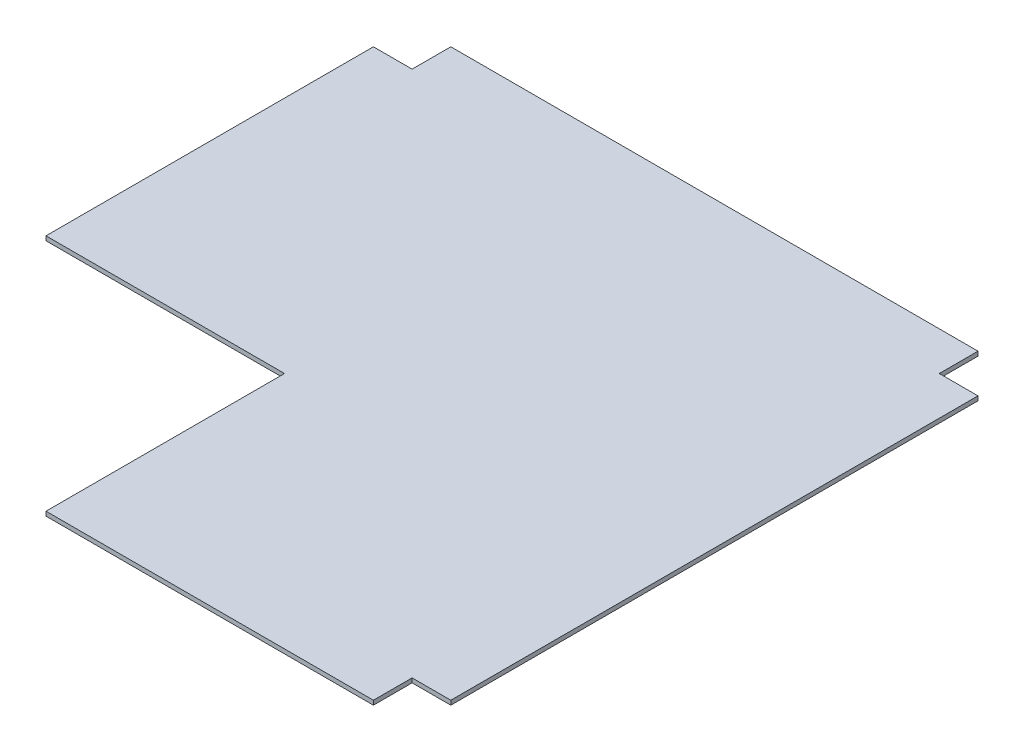
ISO-10303-21;
HEADER;
FILE_DESCRIPTION(('STEP AP214'),'2;1');
FILE_NAME('part.step','',(''),(''),'','','');
FILE_SCHEMA(('AUTOMOTIVE_DESIGN { 1 0 10303 214 1 1 1 1 }'));
ENDSEC;
DATA;
#1=APPLICATION_CONTEXT('core data for automotive mechanical design processes');
#2=APPLICATION_PROTOCOL_DEFINITION('international standard','automotive_design',2000,#1);
#3=PRODUCT_CONTEXT('',#1,'mechanical');
#4=PRODUCT('Part','Part','',(#3));
#5=PRODUCT_RELATED_PRODUCT_CATEGORY('part','',(#4));
#6=PRODUCT_DEFINITION_FORMATION('','',#4);
#7=PRODUCT_DEFINITION_CONTEXT('part definition',#1,'design');
#8=PRODUCT_DEFINITION('design','',#6,#7);
#9=PRODUCT_DEFINITION_SHAPE('','',#8);
#10=(LENGTH_UNIT() NAMED_UNIT(*) SI_UNIT(.MILLI.,.METRE.));
#11=(NAMED_UNIT(*) PLANE_ANGLE_UNIT() SI_UNIT($,.RADIAN.));
#12=(NAMED_UNIT(*) SI_UNIT($,.STERADIAN.) SOLID_ANGLE_UNIT());
#13=UNCERTAINTY_MEASURE_WITH_UNIT(LENGTH_MEASURE(1.E-05),#10,'distance_accuracy_value','');
#14=(GEOMETRIC_REPRESENTATION_CONTEXT(3) GLOBAL_UNCERTAINTY_ASSIGNED_CONTEXT((#13)) GLOBAL_UNIT_ASSIGNED_CONTEXT((#10,
#11,#12)) REPRESENTATION_CONTEXT('',''));
#15=CARTESIAN_POINT('',(0.,0.,0.));
#16=DIRECTION('',(0.,0.,1.));
#17=DIRECTION('',(1.,0.,0.));
#18=AXIS2_PLACEMENT_3D('',#15,#16,#17);
#19=CARTESIAN_POINT('',(175.,3.175,0.));
#20=DIRECTION('',(-1.,0.,0.));
#21=DIRECTION('',(0.,0.,1.));
#22=AXIS2_PLACEMENT_3D('',#19,#20,#21);
#23=PLANE('',#22);
#24=DIRECTION('',(0.,0.,-1.));
#25=VECTOR('',#24,1.);
#26=CARTESIAN_POINT('',(175.,0.,0.));
#27=LINE('',#26,#25);
#28=CARTESIAN_POINT('',(175.,0.,0.));
#29=VERTEX_POINT('',#28);
#30=CARTESIAN_POINT('',(175.,0.,-175.));
#31=VERTEX_POINT('',#30);
#32=EDGE_CURVE('E168',#29,#31,#27,.T.);
#33=ORIENTED_EDGE('',*,*,#32,.F.);
#34=DIRECTION('',(0.,-1.,0.));
#35=VECTOR('',#34,1.);
#36=CARTESIAN_POINT('',(175.,3.175,0.));
#37=LINE('',#36,#35);
#38=CARTESIAN_POINT('',(175.,3.175,0.));
#39=VERTEX_POINT('',#38);
#40=EDGE_CURVE('E11',#39,#29,#37,.T.);
#41=ORIENTED_EDGE('',*,*,#40,.F.);
#42=DIRECTION('',(0.,0.,-1.));
#43=VECTOR('',#42,1.);
#44=CARTESIAN_POINT('',(175.,3.175,0.));
#45=LINE('',#44,#43);
#46=CARTESIAN_POINT('',(175.,3.175,-175.));
#47=VERTEX_POINT('',#46);
#48=EDGE_CURVE('E210',#39,#47,#45,.T.);
#49=ORIENTED_EDGE('',*,*,#48,.T.);
#50=DIRECTION('',(0.,-1.,0.));
#51=VECTOR('',#50,1.);
#52=CARTESIAN_POINT('',(175.,3.175,-175.));
#53=LINE('',#52,#51);
#54=EDGE_CURVE('E108',#47,#31,#53,.T.);
#55=ORIENTED_EDGE('',*,*,#54,.T.);
#56=EDGE_LOOP('',(#33,#41,#49,#55));
#57=FACE_BOUND('',#56,.T.);
#58=ADVANCED_FACE('F45',(#57),#23,.T.);
#59=CARTESIAN_POINT('',(0.,3.175,0.));
#60=DIRECTION('',(0.,0.,-1.));
#61=DIRECTION('',(-1.,0.,0.));
#62=AXIS2_PLACEMENT_3D('',#59,#60,#61);
#63=PLANE('',#62);
#64=DIRECTION('',(1.,0.,0.));
#65=VECTOR('',#64,1.);
#66=CARTESIAN_POINT('',(0.,0.,0.));
#67=LINE('',#66,#65);
#68=CARTESIAN_POINT('',(415.25,0.,0.));
#69=VERTEX_POINT('',#68);
#70=EDGE_CURVE('E172',#29,#69,#67,.T.);
#71=ORIENTED_EDGE('',*,*,#70,.T.);
#72=DIRECTION('',(0.,-1.,0.));
#73=VECTOR('',#72,1.);
#74=CARTESIAN_POINT('',(415.25,3.175,0.));
#75=LINE('',#74,#73);
#76=CARTESIAN_POINT('',(415.25,3.175,0.));
#77=VERTEX_POINT('',#76);
#78=EDGE_CURVE('E54',#77,#69,#75,.T.);
#79=ORIENTED_EDGE('',*,*,#78,.F.);
#80=DIRECTION('',(1.,0.,0.));
#81=VECTOR('',#80,1.);
#82=CARTESIAN_POINT('',(0.,3.175,0.));
#83=LINE('',#82,#81);
#84=EDGE_CURVE('E264',#39,#77,#83,.T.);
#85=ORIENTED_EDGE('',*,*,#84,.F.);
#86=ORIENTED_EDGE('',*,*,#40,.T.);
#87=EDGE_LOOP('',(#71,#79,#85,#86));
#88=FACE_BOUND('',#87,.T.);
#89=ADVANCED_FACE('F299',(#88),#63,.F.);
#90=CARTESIAN_POINT('',(415.25,3.175,0.));
#91=DIRECTION('',(-1.,0.,0.));
#92=DIRECTION('',(0.,0.,1.));
#93=AXIS2_PLACEMENT_3D('',#90,#91,#92);
#94=PLANE('',#93);
#95=DIRECTION('',(0.,0.,-1.));
#96=VECTOR('',#95,1.);
#97=CARTESIAN_POINT('',(415.25,0.,0.));
#98=LINE('',#97,#96);
#99=CARTESIAN_POINT('',(415.25,0.,-28.4));
#100=VERTEX_POINT('',#99);
#101=EDGE_CURVE('E175',#69,#100,#98,.T.);
#102=ORIENTED_EDGE('',*,*,#101,.T.);
#103=DIRECTION('',(0.,-1.,0.));
#104=VECTOR('',#103,1.);
#105=CARTESIAN_POINT('',(415.25,3.175,-28.4));
#106=LINE('',#105,#104);
#107=CARTESIAN_POINT('',(415.25,3.175,-28.4));
#108=VERTEX_POINT('',#107);
#109=EDGE_CURVE('E233',#108,#100,#106,.T.);
#110=ORIENTED_EDGE('',*,*,#109,.F.);
#111=DIRECTION('',(0.,0.,-1.));
#112=VECTOR('',#111,1.);
#113=CARTESIAN_POINT('',(415.25,3.175,0.));
#114=LINE('',#113,#112);
#115=EDGE_CURVE('E243',#77,#108,#114,.T.);
#116=ORIENTED_EDGE('',*,*,#115,.F.);
#117=ORIENTED_EDGE('',*,*,#78,.T.);
#118=EDGE_LOOP('',(#102,#110,#116,#117));
#119=FACE_BOUND('',#118,.T.);
#120=ADVANCED_FACE('F241',(#119),#94,.F.);
#121=CARTESIAN_POINT('',(0.,3.175,-28.3999999999996));
#122=DIRECTION('',(0.,0.,1.));
#123=DIRECTION('',(1.,0.,0.));
#124=AXIS2_PLACEMENT_3D('',#121,#122,#123);
#125=PLANE('',#124);
#126=DIRECTION('',(-1.,0.,0.));
#127=VECTOR('',#126,1.);
#128=CARTESIAN_POINT('',(0.,0.,-28.3999999999996));
#129=LINE('',#128,#127);
#130=CARTESIAN_POINT('',(443.65,0.,-28.4));
#131=VERTEX_POINT('',#130);
#132=EDGE_CURVE('E179',#131,#100,#129,.T.);
#133=ORIENTED_EDGE('',*,*,#132,.F.);
#134=DIRECTION('',(0.,-1.,0.));
#135=VECTOR('',#134,1.);
#136=CARTESIAN_POINT('',(443.65,3.175,-28.4));
#137=LINE('',#136,#135);
#138=CARTESIAN_POINT('',(443.65,3.175,-28.4));
#139=VERTEX_POINT('',#138);
#140=EDGE_CURVE('E230',#139,#131,#137,.T.);
#141=ORIENTED_EDGE('',*,*,#140,.F.);
#142=DIRECTION('',(-1.,0.,0.));
#143=VECTOR('',#142,1.);
#144=CARTESIAN_POINT('',(0.,3.175,-28.3999999999996));
#145=LINE('',#144,#143);
#146=EDGE_CURVE('E256',#139,#108,#145,.T.);
#147=ORIENTED_EDGE('',*,*,#146,.T.);
#148=ORIENTED_EDGE('',*,*,#109,.T.);
#149=EDGE_LOOP('',(#133,#141,#147,#148));
#150=FACE_BOUND('',#149,.T.);
#151=ADVANCED_FACE('F252',(#150),#125,.T.);
#152=CARTESIAN_POINT('',(443.65,3.175,0.));
#153=DIRECTION('',(-1.,0.,0.));
#154=DIRECTION('',(0.,0.,1.));
#155=AXIS2_PLACEMENT_3D('',#152,#153,#154);
#156=PLANE('',#155);
#157=DIRECTION('',(0.,0.,-1.));
#158=VECTOR('',#157,1.);
#159=CARTESIAN_POINT('',(443.65,0.,0.));
#160=LINE('',#159,#158);
#161=CARTESIAN_POINT('',(443.65,0.,-415.25));
#162=VERTEX_POINT('',#161);
#163=EDGE_CURVE('E183',#131,#162,#160,.T.);
#164=ORIENTED_EDGE('',*,*,#163,.T.);
#165=DIRECTION('',(0.,-1.,0.));
#166=VECTOR('',#165,1.);
#167=CARTESIAN_POINT('',(443.65,3.175,-415.25));
#168=LINE('',#167,#166);
#169=CARTESIAN_POINT('',(443.65,3.175,-415.25));
#170=VERTEX_POINT('',#169);
#171=EDGE_CURVE('E226',#170,#162,#168,.T.);
#172=ORIENTED_EDGE('',*,*,#171,.F.);
#173=DIRECTION('',(0.,0.,-1.));
#174=VECTOR('',#173,1.);
#175=CARTESIAN_POINT('',(443.65,3.175,0.));
#176=LINE('',#175,#174);
#177=EDGE_CURVE('E258',#139,#170,#176,.T.);
#178=ORIENTED_EDGE('',*,*,#177,.F.);
#179=ORIENTED_EDGE('',*,*,#140,.T.);
#180=EDGE_LOOP('',(#164,#172,#178,#179));
#181=FACE_BOUND('',#180,.T.);
#182=ADVANCED_FACE('F374',(#181),#156,.F.);
#183=CARTESIAN_POINT('',(8.11655124957036E-13,3.175,-415.250000000001));
#184=DIRECTION('',(0.,0.,1.));
#185=DIRECTION('',(1.,0.,0.));
#186=AXIS2_PLACEMENT_3D('',#183,#184,#185);
#187=PLANE('',#186);
#188=DIRECTION('',(-1.,0.,0.));
#189=VECTOR('',#188,1.);
#190=CARTESIAN_POINT('',(8.11655124957036E-13,0.,-415.250000000001));
#191=LINE('',#190,#189);
#192=CARTESIAN_POINT('',(415.25,0.,-415.25));
#193=VERTEX_POINT('',#192);
#194=EDGE_CURVE('E186',#162,#193,#191,.T.);
#195=ORIENTED_EDGE('',*,*,#194,.T.);
#196=DIRECTION('',(0.,-1.,0.));
#197=VECTOR('',#196,1.);
#198=CARTESIAN_POINT('',(415.25,3.175,-415.25));
#199=LINE('',#198,#197);
#200=CARTESIAN_POINT('',(415.25,3.175,-415.25));
#201=VERTEX_POINT('',#200);
#202=EDGE_CURVE('E223',#201,#193,#199,.T.);
#203=ORIENTED_EDGE('',*,*,#202,.F.);
#204=DIRECTION('',(-1.,0.,0.));
#205=VECTOR('',#204,1.);
#206=CARTESIAN_POINT('',(8.11655124957036E-13,3.175,-415.250000000001));
#207=LINE('',#206,#205);
#208=EDGE_CURVE('E262',#170,#201,#207,.T.);
#209=ORIENTED_EDGE('',*,*,#208,.F.);
#210=ORIENTED_EDGE('',*,*,#171,.T.);
#211=EDGE_LOOP('',(#195,#203,#209,#210));
#212=FACE_BOUND('',#211,.T.);
#213=ADVANCED_FACE('F364',(#212),#187,.F.);
#214=CARTESIAN_POINT('',(415.250000000002,3.175,-1.62331024991408E-12));
#215=DIRECTION('',(1.,0.,0.));
#216=DIRECTION('',(0.,0.,-1.));
#217=AXIS2_PLACEMENT_3D('',#214,#215,#216);
#218=PLANE('',#217);
#219=DIRECTION('',(0.,0.,1.));
#220=VECTOR('',#219,1.);
#221=CARTESIAN_POINT('',(415.250000000002,0.,-1.62331024991408E-12));
#222=LINE('',#221,#220);
#223=CARTESIAN_POINT('',(415.25,0.,-443.65));
#224=VERTEX_POINT('',#223);
#225=EDGE_CURVE('E190',#224,#193,#222,.T.);
#226=ORIENTED_EDGE('',*,*,#225,.F.);
#227=DIRECTION('',(0.,-1.,0.));
#228=VECTOR('',#227,1.);
#229=CARTESIAN_POINT('',(415.25,3.175,-443.65));
#230=LINE('',#229,#228);
#231=CARTESIAN_POINT('',(415.25,3.175,-443.65));
#232=VERTEX_POINT('',#231);
#233=EDGE_CURVE('E220',#232,#224,#230,.T.);
#234=ORIENTED_EDGE('',*,*,#233,.F.);
#235=DIRECTION('',(0.,0.,1.));
#236=VECTOR('',#235,1.);
#237=CARTESIAN_POINT('',(415.250000000002,3.175,-1.62331024991408E-12));
#238=LINE('',#237,#236);
#239=EDGE_CURVE('E270',#232,#201,#238,.T.);
#240=ORIENTED_EDGE('',*,*,#239,.T.);
#241=ORIENTED_EDGE('',*,*,#202,.T.);
#242=EDGE_LOOP('',(#226,#234,#240,#241));
#243=FACE_BOUND('',#242,.T.);
#244=ADVANCED_FACE('F286',(#243),#218,.T.);
#245=CARTESIAN_POINT('',(0.,3.175,-443.65));
#246=DIRECTION('',(0.,0.,-1.));
#247=DIRECTION('',(-1.,0.,0.));
#248=AXIS2_PLACEMENT_3D('',#245,#246,#247);
#249=PLANE('',#248);
#250=DIRECTION('',(1.,0.,0.));
#251=VECTOR('',#250,1.);
#252=CARTESIAN_POINT('',(0.,0.,-443.65));
#253=LINE('',#252,#251);
#254=CARTESIAN_POINT('',(28.4,0.,-443.65));
#255=VERTEX_POINT('',#254);
#256=EDGE_CURVE('E194',#255,#224,#253,.T.);
#257=ORIENTED_EDGE('',*,*,#256,.F.);
#258=DIRECTION('',(0.,-1.,0.));
#259=VECTOR('',#258,1.);
#260=CARTESIAN_POINT('',(28.4,3.175,-443.65));
#261=LINE('',#260,#259);
#262=CARTESIAN_POINT('',(28.4,3.175,-443.65));
#263=VERTEX_POINT('',#262);
#264=EDGE_CURVE('E217',#263,#255,#261,.T.);
#265=ORIENTED_EDGE('',*,*,#264,.F.);
#266=DIRECTION('',(1.,0.,0.));
#267=VECTOR('',#266,1.);
#268=CARTESIAN_POINT('',(0.,3.175,-443.65));
#269=LINE('',#268,#267);
#270=EDGE_CURVE('E274',#263,#232,#269,.T.);
#271=ORIENTED_EDGE('',*,*,#270,.T.);
#272=ORIENTED_EDGE('',*,*,#233,.T.);
#273=EDGE_LOOP('',(#257,#265,#271,#272));
#274=FACE_BOUND('',#273,.T.);
#275=ADVANCED_FACE('F280',(#274),#249,.T.);
#276=CARTESIAN_POINT('',(28.4000000000013,3.175,0.));
#277=DIRECTION('',(1.,0.,0.));
#278=DIRECTION('',(0.,0.,-1.));
#279=AXIS2_PLACEMENT_3D('',#276,#277,#278);
#280=PLANE('',#279);
#281=DIRECTION('',(0.,0.,1.));
#282=VECTOR('',#281,1.);
#283=CARTESIAN_POINT('',(28.4000000000013,0.,0.));
#284=LINE('',#283,#282);
#285=CARTESIAN_POINT('',(28.4000000000001,0.,-415.25));
#286=VERTEX_POINT('',#285);
#287=EDGE_CURVE('E198',#255,#286,#284,.T.);
#288=ORIENTED_EDGE('',*,*,#287,.T.);
#289=DIRECTION('',(0.,-1.,0.));
#290=VECTOR('',#289,1.);
#291=CARTESIAN_POINT('',(28.4000000000001,3.175,-415.25));
#292=LINE('',#291,#290);
#293=CARTESIAN_POINT('',(28.4000000000001,3.175,-415.25));
#294=VERTEX_POINT('',#293);
#295=EDGE_CURVE('E151',#294,#286,#292,.T.);
#296=ORIENTED_EDGE('',*,*,#295,.F.);
#297=DIRECTION('',(0.,0.,1.));
#298=VECTOR('',#297,1.);
#299=CARTESIAN_POINT('',(28.4000000000013,3.175,0.));
#300=LINE('',#299,#298);
#301=EDGE_CURVE('E157',#263,#294,#300,.T.);
#302=ORIENTED_EDGE('',*,*,#301,.F.);
#303=ORIENTED_EDGE('',*,*,#264,.T.);
#304=EDGE_LOOP('',(#288,#296,#302,#303));
#305=FACE_BOUND('',#304,.T.);
#306=ADVANCED_FACE('F289',(#305),#280,.F.);
#307=CARTESIAN_POINT('',(8.11655124957035E-13,3.175,-415.25));
#308=DIRECTION('',(0.,0.,-1.));
#309=DIRECTION('',(-1.,0.,0.));
#310=AXIS2_PLACEMENT_3D('',#307,#308,#309);
#311=PLANE('',#310);
#312=DIRECTION('',(1.,0.,0.));
#313=VECTOR('',#312,1.);
#314=CARTESIAN_POINT('',(8.11655124957035E-13,0.,-415.25));
#315=LINE('',#314,#313);
#316=CARTESIAN_POINT('',(0.,0.,-415.25));
#317=VERTEX_POINT('',#316);
#318=EDGE_CURVE('E145',#317,#286,#315,.T.);
#319=ORIENTED_EDGE('',*,*,#318,.F.);
#320=DIRECTION('',(0.,-1.,0.));
#321=VECTOR('',#320,1.);
#322=CARTESIAN_POINT('',(0.,3.175,-415.25));
#323=LINE('',#322,#321);
#324=CARTESIAN_POINT('',(0.,3.175,-415.25));
#325=VERTEX_POINT('',#324);
#326=EDGE_CURVE('E140',#325,#317,#323,.T.);
#327=ORIENTED_EDGE('',*,*,#326,.F.);
#328=DIRECTION('',(1.,0.,0.));
#329=VECTOR('',#328,1.);
#330=CARTESIAN_POINT('',(8.11655124957035E-13,3.175,-415.25));
#331=LINE('',#330,#329);
#332=EDGE_CURVE('E143',#325,#294,#331,.T.);
#333=ORIENTED_EDGE('',*,*,#332,.T.);
#334=ORIENTED_EDGE('',*,*,#295,.T.);
#335=EDGE_LOOP('',(#319,#327,#333,#334));
#336=FACE_BOUND('',#335,.T.);
#337=ADVANCED_FACE('F142',(#336),#311,.T.);
#338=CARTESIAN_POINT('',(0.,3.175,0.));
#339=DIRECTION('',(-1.,0.,0.));
#340=DIRECTION('',(0.,0.,1.));
#341=AXIS2_PLACEMENT_3D('',#338,#339,#340);
#342=PLANE('',#341);
#343=DIRECTION('',(0.,0.,-1.));
#344=VECTOR('',#343,1.);
#345=CARTESIAN_POINT('',(0.,0.,0.));
#346=LINE('',#345,#344);
#347=CARTESIAN_POINT('',(0.,0.,-175.));
#348=VERTEX_POINT('',#347);
#349=EDGE_CURVE('E204',#348,#317,#346,.T.);
#350=ORIENTED_EDGE('',*,*,#349,.F.);
#351=DIRECTION('',(0.,-1.,0.));
#352=VECTOR('',#351,1.);
#353=CARTESIAN_POINT('',(0.,3.175,-175.));
#354=LINE('',#353,#352);
#355=CARTESIAN_POINT('',(0.,3.175,-175.));
#356=VERTEX_POINT('',#355);
#357=EDGE_CURVE('E101',#356,#348,#354,.T.);
#358=ORIENTED_EDGE('',*,*,#357,.F.);
#359=DIRECTION('',(0.,0.,-1.));
#360=VECTOR('',#359,1.);
#361=CARTESIAN_POINT('',(0.,3.175,0.));
#362=LINE('',#361,#360);
#363=EDGE_CURVE('E154',#356,#325,#362,.T.);
#364=ORIENTED_EDGE('',*,*,#363,.T.);
#365=ORIENTED_EDGE('',*,*,#326,.T.);
#366=EDGE_LOOP('',(#350,#358,#364,#365));
#367=FACE_BOUND('',#366,.T.);
#368=ADVANCED_FACE('F161',(#367),#342,.T.);
#369=CARTESIAN_POINT('',(0.,3.175,-175.));
#370=DIRECTION('',(0.,0.,-1.));
#371=DIRECTION('',(-1.,0.,0.));
#372=AXIS2_PLACEMENT_3D('',#369,#370,#371);
#373=PLANE('',#372);
#374=DIRECTION('',(1.,0.,0.));
#375=VECTOR('',#374,1.);
#376=CARTESIAN_POINT('',(0.,0.,-175.));
#377=LINE('',#376,#375);
#378=EDGE_CURVE('E207',#348,#31,#377,.T.);
#379=ORIENTED_EDGE('',*,*,#378,.T.);
#380=ORIENTED_EDGE('',*,*,#54,.F.);
#381=DIRECTION('',(1.,0.,0.));
#382=VECTOR('',#381,1.);
#383=CARTESIAN_POINT('',(0.,3.175,-175.));
#384=LINE('',#383,#382);
#385=EDGE_CURVE('E62',#356,#47,#384,.T.);
#386=ORIENTED_EDGE('',*,*,#385,.F.);
#387=ORIENTED_EDGE('',*,*,#357,.T.);
#388=EDGE_LOOP('',(#379,#380,#386,#387));
#389=FACE_BOUND('',#388,.T.);
#390=ADVANCED_FACE('F303',(#389),#373,.F.);
#391=CARTESIAN_POINT('',(0.,3.175,0.));
#392=DIRECTION('',(0.,1.,0.));
#393=DIRECTION('',(0.,0.,1.));
#394=AXIS2_PLACEMENT_3D('',#391,#392,#393);
#395=PLANE('',#394);
#396=ORIENTED_EDGE('',*,*,#48,.F.);
#397=ORIENTED_EDGE('',*,*,#84,.T.);
#398=ORIENTED_EDGE('',*,*,#115,.T.);
#399=ORIENTED_EDGE('',*,*,#146,.F.);
#400=ORIENTED_EDGE('',*,*,#177,.T.);
#401=ORIENTED_EDGE('',*,*,#208,.T.);
#402=ORIENTED_EDGE('',*,*,#239,.F.);
#403=ORIENTED_EDGE('',*,*,#270,.F.);
#404=ORIENTED_EDGE('',*,*,#301,.T.);
#405=ORIENTED_EDGE('',*,*,#332,.F.);
#406=ORIENTED_EDGE('',*,*,#363,.F.);
#407=ORIENTED_EDGE('',*,*,#385,.T.);
#408=EDGE_LOOP('',(#396,#397,#398,#399,#400,#401,#402,#403,#404,#405,#406,#407));
#409=FACE_BOUND('',#408,.T.);
#410=ADVANCED_FACE('F153',(#409),#395,.T.);
#411=CARTESIAN_POINT('',(0.,0.,0.));
#412=DIRECTION('',(0.,1.,0.));
#413=DIRECTION('',(0.,0.,1.));
#414=AXIS2_PLACEMENT_3D('',#411,#412,#413);
#415=PLANE('',#414);
#416=ORIENTED_EDGE('',*,*,#32,.T.);
#417=ORIENTED_EDGE('',*,*,#378,.F.);
#418=ORIENTED_EDGE('',*,*,#349,.T.);
#419=ORIENTED_EDGE('',*,*,#318,.T.);
#420=ORIENTED_EDGE('',*,*,#287,.F.);
#421=ORIENTED_EDGE('',*,*,#256,.T.);
#422=ORIENTED_EDGE('',*,*,#225,.T.);
#423=ORIENTED_EDGE('',*,*,#194,.F.);
#424=ORIENTED_EDGE('',*,*,#163,.F.);
#425=ORIENTED_EDGE('',*,*,#132,.T.);
#426=ORIENTED_EDGE('',*,*,#101,.F.);
#427=ORIENTED_EDGE('',*,*,#70,.F.);
#428=EDGE_LOOP('',(#416,#417,#418,#419,#420,#421,#422,#423,#424,#425,#426,#427));
#429=FACE_BOUND('',#428,.T.);
#430=ADVANCED_FACE('F247',(#429),#415,.F.);
#431=CLOSED_SHELL('',(#58,#89,#120,#151,#182,#213,#244,#275,#306,#337,#368,#390,#410,#430));
#432=MANIFOLD_SOLID_BREP('B2',#431);
#433=ADVANCED_BREP_SHAPE_REPRESENTATION('',(#18,#432),#14);
#434=SHAPE_DEFINITION_REPRESENTATION(#9,#433);
ENDSEC;
END-ISO-10303-21;
